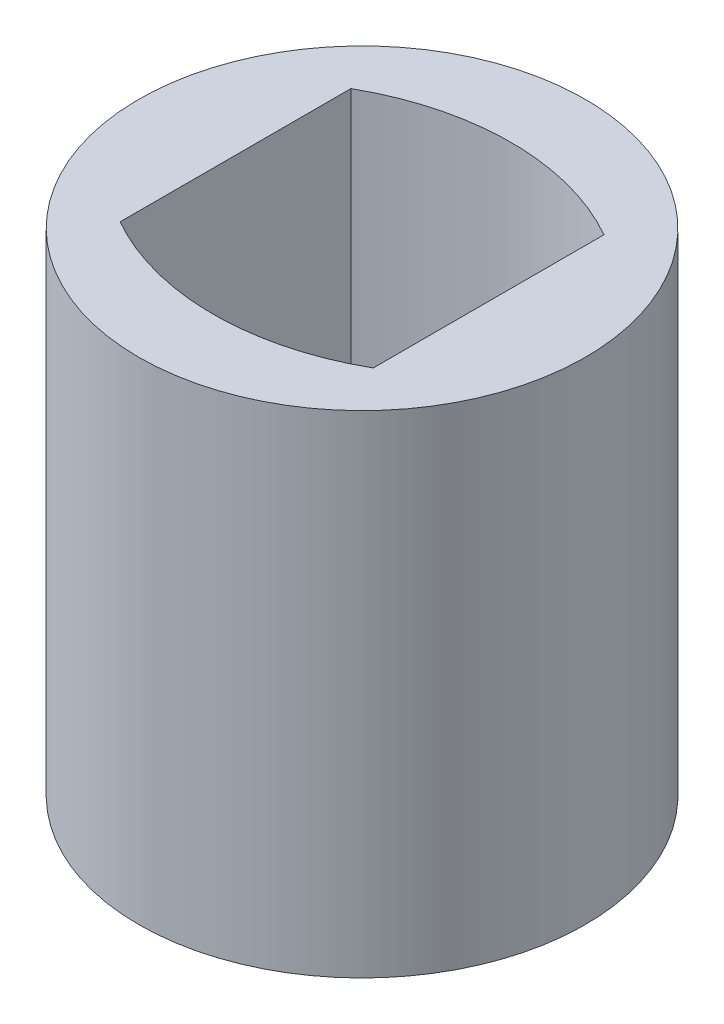
ISO-10303-21;
HEADER;
FILE_DESCRIPTION(('STEP AP214'),'2;1');
FILE_NAME('part.step','',(''),(''),'','','');
FILE_SCHEMA(('AUTOMOTIVE_DESIGN { 1 0 10303 214 1 1 1 1 }'));
ENDSEC;
DATA;
#1=APPLICATION_CONTEXT('core data for automotive mechanical design processes');
#2=APPLICATION_PROTOCOL_DEFINITION('international standard','automotive_design',2000,#1);
#3=PRODUCT_CONTEXT('',#1,'mechanical');
#4=PRODUCT('Part','Part','',(#3));
#5=PRODUCT_RELATED_PRODUCT_CATEGORY('part','',(#4));
#6=PRODUCT_DEFINITION_FORMATION('','',#4);
#7=PRODUCT_DEFINITION_CONTEXT('part definition',#1,'design');
#8=PRODUCT_DEFINITION('design','',#6,#7);
#9=PRODUCT_DEFINITION_SHAPE('','',#8);
#10=(LENGTH_UNIT() NAMED_UNIT(*) SI_UNIT(.MILLI.,.METRE.));
#11=(NAMED_UNIT(*) PLANE_ANGLE_UNIT() SI_UNIT($,.RADIAN.));
#12=(NAMED_UNIT(*) SI_UNIT($,.STERADIAN.) SOLID_ANGLE_UNIT());
#13=UNCERTAINTY_MEASURE_WITH_UNIT(LENGTH_MEASURE(1.E-05),#10,'distance_accuracy_value','');
#14=(GEOMETRIC_REPRESENTATION_CONTEXT(3) GLOBAL_UNCERTAINTY_ASSIGNED_CONTEXT((#13)) GLOBAL_UNIT_ASSIGNED_CONTEXT((#10,
#11,#12)) REPRESENTATION_CONTEXT('',''));
#15=CARTESIAN_POINT('',(0.,0.,0.));
#16=DIRECTION('',(0.,0.,1.));
#17=DIRECTION('',(1.,0.,0.));
#18=AXIS2_PLACEMENT_3D('',#15,#16,#17);
#19=CARTESIAN_POINT('',(0.,-1.27,0.));
#20=DIRECTION('',(0.,1.,0.));
#21=DIRECTION('',(0.,0.,1.));
#22=AXIS2_PLACEMENT_3D('',#19,#20,#21);
#23=PLANE('',#22);
#24=CARTESIAN_POINT('',(0.,-1.27,0.));
#25=DIRECTION('',(0.,1.,0.));
#26=DIRECTION('',(0.,0.,1.));
#27=AXIS2_PLACEMENT_3D('',#24,#25,#26);
#28=CIRCLE('',#27,3.81);
#29=CARTESIAN_POINT('',(0.,-1.27,3.81));
#30=VERTEX_POINT('',#29);
#31=EDGE_CURVE('E11',#30,#30,#28,.T.);
#32=ORIENTED_EDGE('',*,*,#31,.F.);
#33=EDGE_LOOP('',(#32));
#34=FACE_BOUND('',#33,.T.);
#35=CARTESIAN_POINT('',(0.,-1.27,-0.0518583333333272));
#36=DIRECTION('',(0.,-1.,0.));
#37=DIRECTION('',(0.,0.,1.));
#38=AXIS2_PLACEMENT_3D('',#35,#36,#37);
#39=CIRCLE('',#38,1.44885833333333);
#40=CARTESIAN_POINT('',(0.889000000000001,-1.27,1.0922));
#41=VERTEX_POINT('',#40);
#42=CARTESIAN_POINT('',(-0.888999999999999,-1.27,1.0922));
#43=VERTEX_POINT('',#42);
#44=EDGE_CURVE('E108',#41,#43,#39,.T.);
#45=ORIENTED_EDGE('',*,*,#44,.F.);
#46=DIRECTION('',(0.,0.,1.));
#47=VECTOR('',#46,1.);
#48=CARTESIAN_POINT('',(0.889000000000001,-1.27,1.0922));
#49=LINE('',#48,#47);
#50=CARTESIAN_POINT('',(0.889000000000001,-1.27,-1.0922));
#51=VERTEX_POINT('',#50);
#52=EDGE_CURVE('E143',#51,#41,#49,.T.);
#53=ORIENTED_EDGE('',*,*,#52,.F.);
#54=CARTESIAN_POINT('',(0.,-1.27,0.0518583333333265));
#55=DIRECTION('',(0.,-1.,0.));
#56=DIRECTION('',(0.,0.,-1.));
#57=AXIS2_PLACEMENT_3D('',#54,#55,#56);
#58=CIRCLE('',#57,1.44885833333333);
#59=CARTESIAN_POINT('',(-0.888999999999999,-1.27,-1.0922));
#60=VERTEX_POINT('',#59);
#61=EDGE_CURVE('E155',#60,#51,#58,.T.);
#62=ORIENTED_EDGE('',*,*,#61,.F.);
#63=DIRECTION('',(0.,0.,-1.));
#64=VECTOR('',#63,1.);
#65=CARTESIAN_POINT('',(-0.888999999999999,-1.27,1.0922));
#66=LINE('',#65,#64);
#67=EDGE_CURVE('E152',#43,#60,#66,.T.);
#68=ORIENTED_EDGE('',*,*,#67,.F.);
#69=EDGE_LOOP('',(#45,#53,#62,#68));
#70=FACE_BOUND('',#69,.T.);
#71=ADVANCED_FACE('F35',(#34,#70),#23,.F.);
#72=CARTESIAN_POINT('',(0.,1.27,0.));
#73=DIRECTION('',(0.,-1.,0.));
#74=DIRECTION('',(0.,0.,-1.));
#75=AXIS2_PLACEMENT_3D('',#72,#73,#74);
#76=CYLINDRICAL_SURFACE('',#75,3.81);
#77=ORIENTED_EDGE('',*,*,#31,.T.);
#78=EDGE_LOOP('',(#77));
#79=FACE_BOUND('',#78,.T.);
#80=CARTESIAN_POINT('',(0.,7.112,0.));
#81=DIRECTION('',(0.,1.,0.));
#82=DIRECTION('',(0.,0.,1.));
#83=AXIS2_PLACEMENT_3D('',#80,#81,#82);
#84=CIRCLE('',#83,3.81);
#85=CARTESIAN_POINT('',(0.,7.112,3.81));
#86=VERTEX_POINT('',#85);
#87=EDGE_CURVE('E121',#86,#86,#84,.T.);
#88=ORIENTED_EDGE('',*,*,#87,.F.);
#89=EDGE_LOOP('',(#88));
#90=FACE_BOUND('',#89,.T.);
#91=ADVANCED_FACE('F37',(#79,#90),#76,.T.);
#92=CARTESIAN_POINT('',(0.,-2.54,-0.0518583333333272));
#93=DIRECTION('',(0.,1.,0.));
#94=DIRECTION('',(0.,0.,1.));
#95=AXIS2_PLACEMENT_3D('',#92,#93,#94);
#96=CYLINDRICAL_SURFACE('',#95,1.44885833333333);
#97=ORIENTED_EDGE('',*,*,#44,.T.);
#98=DIRECTION('',(0.,1.,0.));
#99=VECTOR('',#98,1.);
#100=CARTESIAN_POINT('',(-0.888999999999999,-2.54,1.0922));
#101=LINE('',#100,#99);
#102=CARTESIAN_POINT('',(-0.888999999999999,-2.54,1.0922));
#103=VERTEX_POINT('',#102);
#104=EDGE_CURVE('E43',#103,#43,#101,.T.);
#105=ORIENTED_EDGE('',*,*,#104,.F.);
#106=CARTESIAN_POINT('',(0.,-2.54,-0.0518583333333272));
#107=DIRECTION('',(0.,-1.,0.));
#108=DIRECTION('',(0.,0.,1.));
#109=AXIS2_PLACEMENT_3D('',#106,#107,#108);
#110=CIRCLE('',#109,1.44885833333333);
#111=CARTESIAN_POINT('',(0.889000000000001,-2.54,1.0922));
#112=VERTEX_POINT('',#111);
#113=EDGE_CURVE('E139',#112,#103,#110,.T.);
#114=ORIENTED_EDGE('',*,*,#113,.F.);
#115=DIRECTION('',(0.,1.,0.));
#116=VECTOR('',#115,1.);
#117=CARTESIAN_POINT('',(0.889000000000001,-2.54,1.0922));
#118=LINE('',#117,#116);
#119=EDGE_CURVE('E149',#112,#41,#118,.T.);
#120=ORIENTED_EDGE('',*,*,#119,.T.);
#121=EDGE_LOOP('',(#97,#105,#114,#120));
#122=FACE_BOUND('',#121,.T.);
#123=ADVANCED_FACE('F174',(#122),#96,.T.);
#124=CARTESIAN_POINT('',(-0.888999999999999,-2.54,1.0922));
#125=DIRECTION('',(1.,0.,0.));
#126=DIRECTION('',(0.,0.,-1.));
#127=AXIS2_PLACEMENT_3D('',#124,#125,#126);
#128=PLANE('',#127);
#129=ORIENTED_EDGE('',*,*,#67,.T.);
#130=DIRECTION('',(0.,1.,0.));
#131=VECTOR('',#130,1.);
#132=CARTESIAN_POINT('',(-0.888999999999999,-2.54,-1.0922));
#133=LINE('',#132,#131);
#134=CARTESIAN_POINT('',(-0.888999999999999,-2.54,-1.0922));
#135=VERTEX_POINT('',#134);
#136=EDGE_CURVE('E165',#135,#60,#133,.T.);
#137=ORIENTED_EDGE('',*,*,#136,.F.);
#138=DIRECTION('',(0.,0.,-1.));
#139=VECTOR('',#138,1.);
#140=CARTESIAN_POINT('',(-0.888999999999999,-2.54,1.0922));
#141=LINE('',#140,#139);
#142=EDGE_CURVE('E142',#103,#135,#141,.T.);
#143=ORIENTED_EDGE('',*,*,#142,.F.);
#144=ORIENTED_EDGE('',*,*,#104,.T.);
#145=EDGE_LOOP('',(#129,#137,#143,#144));
#146=FACE_BOUND('',#145,.T.);
#147=ADVANCED_FACE('F170',(#146),#128,.F.);
#148=CARTESIAN_POINT('',(0.,-2.54,0.0518583333333265));
#149=DIRECTION('',(0.,1.,0.));
#150=DIRECTION('',(0.,0.,1.));
#151=AXIS2_PLACEMENT_3D('',#148,#149,#150);
#152=CYLINDRICAL_SURFACE('',#151,1.44885833333333);
#153=ORIENTED_EDGE('',*,*,#61,.T.);
#154=DIRECTION('',(0.,1.,0.));
#155=VECTOR('',#154,1.);
#156=CARTESIAN_POINT('',(0.889,-2.54,-1.0922));
#157=LINE('',#156,#155);
#158=CARTESIAN_POINT('',(0.889,-2.54,-1.0922));
#159=VERTEX_POINT('',#158);
#160=EDGE_CURVE('E162',#159,#51,#157,.T.);
#161=ORIENTED_EDGE('',*,*,#160,.F.);
#162=CARTESIAN_POINT('',(0.,-2.54,0.0518583333333265));
#163=DIRECTION('',(0.,-1.,0.));
#164=DIRECTION('',(0.,0.,-1.));
#165=AXIS2_PLACEMENT_3D('',#162,#163,#164);
#166=CIRCLE('',#165,1.44885833333333);
#167=EDGE_CURVE('E145',#135,#159,#166,.T.);
#168=ORIENTED_EDGE('',*,*,#167,.F.);
#169=ORIENTED_EDGE('',*,*,#136,.T.);
#170=EDGE_LOOP('',(#153,#161,#168,#169));
#171=FACE_BOUND('',#170,.T.);
#172=ADVANCED_FACE('F183',(#171),#152,.T.);
#173=CARTESIAN_POINT('',(0.889000000000001,-2.54,1.0922));
#174=DIRECTION('',(-1.,0.,0.));
#175=DIRECTION('',(0.,0.,1.));
#176=AXIS2_PLACEMENT_3D('',#173,#174,#175);
#177=PLANE('',#176);
#178=ORIENTED_EDGE('',*,*,#52,.T.);
#179=ORIENTED_EDGE('',*,*,#119,.F.);
#180=DIRECTION('',(0.,0.,1.));
#181=VECTOR('',#180,1.);
#182=CARTESIAN_POINT('',(0.889000000000001,-2.54,1.0922));
#183=LINE('',#182,#181);
#184=EDGE_CURVE('E147',#159,#112,#183,.T.);
#185=ORIENTED_EDGE('',*,*,#184,.F.);
#186=ORIENTED_EDGE('',*,*,#160,.T.);
#187=EDGE_LOOP('',(#178,#179,#185,#186));
#188=FACE_BOUND('',#187,.T.);
#189=ADVANCED_FACE('F178',(#188),#177,.F.);
#190=CARTESIAN_POINT('',(0.,-2.54,-0.0518583333333272));
#191=DIRECTION('',(0.,1.,0.));
#192=DIRECTION('',(0.,0.,1.));
#193=AXIS2_PLACEMENT_3D('',#190,#191,#192);
#194=PLANE('',#193);
#195=ORIENTED_EDGE('',*,*,#113,.T.);
#196=ORIENTED_EDGE('',*,*,#142,.T.);
#197=ORIENTED_EDGE('',*,*,#167,.T.);
#198=ORIENTED_EDGE('',*,*,#184,.T.);
#199=EDGE_LOOP('',(#195,#196,#197,#198));
#200=FACE_BOUND('',#199,.T.);
#201=ADVANCED_FACE('F185',(#200),#194,.F.);
#202=CARTESIAN_POINT('',(-2.159,7.112,0.));
#203=DIRECTION('',(1.,0.,0.));
#204=DIRECTION('',(0.,0.,-1.));
#205=AXIS2_PLACEMENT_3D('',#202,#203,#204);
#206=PLANE('',#205);
#207=DIRECTION('',(0.,0.,1.));
#208=VECTOR('',#207,1.);
#209=CARTESIAN_POINT('',(-2.159,1.27,0.));
#210=LINE('',#209,#208);
#211=CARTESIAN_POINT('',(-2.159,1.27,-1.9685));
#212=VERTEX_POINT('',#211);
#213=CARTESIAN_POINT('',(-2.159,1.27,1.9685));
#214=VERTEX_POINT('',#213);
#215=EDGE_CURVE('E106',#212,#214,#210,.T.);
#216=ORIENTED_EDGE('',*,*,#215,.F.);
#217=DIRECTION('',(0.,-1.,0.));
#218=VECTOR('',#217,1.);
#219=CARTESIAN_POINT('',(-2.159,7.112,-1.9685));
#220=LINE('',#219,#218);
#221=CARTESIAN_POINT('',(-2.159,7.112,-1.9685));
#222=VERTEX_POINT('',#221);
#223=EDGE_CURVE('E99',#222,#212,#220,.T.);
#224=ORIENTED_EDGE('',*,*,#223,.F.);
#225=DIRECTION('',(0.,0.,1.));
#226=VECTOR('',#225,1.);
#227=CARTESIAN_POINT('',(-2.159,7.112,0.));
#228=LINE('',#227,#226);
#229=CARTESIAN_POINT('',(-2.159,7.112,1.9685));
#230=VERTEX_POINT('',#229);
#231=EDGE_CURVE('E104',#222,#230,#228,.T.);
#232=ORIENTED_EDGE('',*,*,#231,.T.);
#233=DIRECTION('',(0.,-1.,0.));
#234=VECTOR('',#233,1.);
#235=CARTESIAN_POINT('',(-2.159,7.112,1.9685));
#236=LINE('',#235,#234);
#237=EDGE_CURVE('E129',#230,#214,#236,.T.);
#238=ORIENTED_EDGE('',*,*,#237,.T.);
#239=EDGE_LOOP('',(#216,#224,#232,#238));
#240=FACE_BOUND('',#239,.T.);
#241=ADVANCED_FACE('F101',(#240),#206,.T.);
#242=CARTESIAN_POINT('',(0.,7.112,1.8238611111111));
#243=DIRECTION('',(0.,-1.,0.));
#244=DIRECTION('',(0.,0.,-1.));
#245=AXIS2_PLACEMENT_3D('',#242,#243,#244);
#246=CYLINDRICAL_SURFACE('',#245,4.3638611111111);
#247=CARTESIAN_POINT('',(0.,1.27,1.8238611111111));
#248=DIRECTION('',(0.,1.,0.));
#249=DIRECTION('',(0.,0.,1.));
#250=AXIS2_PLACEMENT_3D('',#247,#248,#249);
#251=CIRCLE('',#250,4.3638611111111);
#252=CARTESIAN_POINT('',(2.159,1.27,-1.9685));
#253=VERTEX_POINT('',#252);
#254=EDGE_CURVE('E50',#212,#253,#251,.F.);
#255=ORIENTED_EDGE('',*,*,#254,.T.);
#256=DIRECTION('',(0.,-1.,0.));
#257=VECTOR('',#256,1.);
#258=CARTESIAN_POINT('',(2.159,7.112,-1.9685));
#259=LINE('',#258,#257);
#260=CARTESIAN_POINT('',(2.159,7.112,-1.9685));
#261=VERTEX_POINT('',#260);
#262=EDGE_CURVE('E109',#261,#253,#259,.T.);
#263=ORIENTED_EDGE('',*,*,#262,.F.);
#264=CARTESIAN_POINT('',(0.,7.112,1.8238611111111));
#265=DIRECTION('',(0.,1.,0.));
#266=DIRECTION('',(0.,0.,1.));
#267=AXIS2_PLACEMENT_3D('',#264,#265,#266);
#268=CIRCLE('',#267,4.3638611111111);
#269=EDGE_CURVE('E113',#222,#261,#268,.F.);
#270=ORIENTED_EDGE('',*,*,#269,.F.);
#271=ORIENTED_EDGE('',*,*,#223,.T.);
#272=EDGE_LOOP('',(#255,#263,#270,#271));
#273=FACE_BOUND('',#272,.T.);
#274=ADVANCED_FACE('F114',(#273),#246,.F.);
#275=CARTESIAN_POINT('',(2.159,7.112,0.));
#276=DIRECTION('',(1.,0.,0.));
#277=DIRECTION('',(0.,0.,-1.));
#278=AXIS2_PLACEMENT_3D('',#275,#276,#277);
#279=PLANE('',#278);
#280=DIRECTION('',(0.,0.,1.));
#281=VECTOR('',#280,1.);
#282=CARTESIAN_POINT('',(2.159,1.27,0.));
#283=LINE('',#282,#281);
#284=CARTESIAN_POINT('',(2.159,1.27,1.9685));
#285=VERTEX_POINT('',#284);
#286=EDGE_CURVE('E55',#253,#285,#283,.T.);
#287=ORIENTED_EDGE('',*,*,#286,.T.);
#288=DIRECTION('',(0.,-1.,0.));
#289=VECTOR('',#288,1.);
#290=CARTESIAN_POINT('',(2.159,7.112,1.9685));
#291=LINE('',#290,#289);
#292=CARTESIAN_POINT('',(2.159,7.112,1.9685));
#293=VERTEX_POINT('',#292);
#294=EDGE_CURVE('E135',#293,#285,#291,.T.);
#295=ORIENTED_EDGE('',*,*,#294,.F.);
#296=DIRECTION('',(0.,0.,1.));
#297=VECTOR('',#296,1.);
#298=CARTESIAN_POINT('',(2.159,7.112,0.));
#299=LINE('',#298,#297);
#300=EDGE_CURVE('E116',#261,#293,#299,.T.);
#301=ORIENTED_EDGE('',*,*,#300,.F.);
#302=ORIENTED_EDGE('',*,*,#262,.T.);
#303=EDGE_LOOP('',(#287,#295,#301,#302));
#304=FACE_BOUND('',#303,.T.);
#305=ADVANCED_FACE('F245',(#304),#279,.F.);
#306=CARTESIAN_POINT('',(0.,7.112,-1.82386111111112));
#307=DIRECTION('',(0.,-1.,0.));
#308=DIRECTION('',(0.,0.,-1.));
#309=AXIS2_PLACEMENT_3D('',#306,#307,#308);
#310=CYLINDRICAL_SURFACE('',#309,4.36386111111112);
#311=CARTESIAN_POINT('',(0.,1.27,-1.82386111111112));
#312=DIRECTION('',(0.,1.,0.));
#313=DIRECTION('',(0.,0.,1.));
#314=AXIS2_PLACEMENT_3D('',#311,#312,#313);
#315=CIRCLE('',#314,4.36386111111112);
#316=EDGE_CURVE('E124',#214,#285,#315,.T.);
#317=ORIENTED_EDGE('',*,*,#316,.F.);
#318=ORIENTED_EDGE('',*,*,#237,.F.);
#319=CARTESIAN_POINT('',(0.,7.112,-1.82386111111112));
#320=DIRECTION('',(0.,1.,0.));
#321=DIRECTION('',(0.,0.,1.));
#322=AXIS2_PLACEMENT_3D('',#319,#320,#321);
#323=CIRCLE('',#322,4.36386111111112);
#324=EDGE_CURVE('E120',#230,#293,#323,.T.);
#325=ORIENTED_EDGE('',*,*,#324,.T.);
#326=ORIENTED_EDGE('',*,*,#294,.T.);
#327=EDGE_LOOP('',(#317,#318,#325,#326));
#328=FACE_BOUND('',#327,.T.);
#329=ADVANCED_FACE('F254',(#328),#310,.F.);
#330=CARTESIAN_POINT('',(0.,7.112,0.));
#331=DIRECTION('',(0.,1.,0.));
#332=DIRECTION('',(0.,0.,1.));
#333=AXIS2_PLACEMENT_3D('',#330,#331,#332);
#334=PLANE('',#333);
#335=ORIENTED_EDGE('',*,*,#87,.T.);
#336=EDGE_LOOP('',(#335));
#337=FACE_BOUND('',#336,.T.);
#338=ORIENTED_EDGE('',*,*,#231,.F.);
#339=ORIENTED_EDGE('',*,*,#269,.T.);
#340=ORIENTED_EDGE('',*,*,#300,.T.);
#341=ORIENTED_EDGE('',*,*,#324,.F.);
#342=EDGE_LOOP('',(#338,#339,#340,#341));
#343=FACE_BOUND('',#342,.T.);
#344=ADVANCED_FACE('F118',(#337,#343),#334,.T.);
#345=CARTESIAN_POINT('',(0.,1.27,0.));
#346=DIRECTION('',(0.,1.,0.));
#347=DIRECTION('',(0.,0.,1.));
#348=AXIS2_PLACEMENT_3D('',#345,#346,#347);
#349=PLANE('',#348);
#350=ORIENTED_EDGE('',*,*,#215,.T.);
#351=ORIENTED_EDGE('',*,*,#316,.T.);
#352=ORIENTED_EDGE('',*,*,#286,.F.);
#353=ORIENTED_EDGE('',*,*,#254,.F.);
#354=EDGE_LOOP('',(#350,#351,#352,#353));
#355=FACE_BOUND('',#354,.T.);
#356=ADVANCED_FACE('F202',(#355),#349,.T.);
#357=CLOSED_SHELL('',(#71,#91,#123,#147,#172,#189,#201,#241,#274,#305,#329,#344,#356));
#358=MANIFOLD_SOLID_BREP('B2',#357);
#359=ADVANCED_BREP_SHAPE_REPRESENTATION('',(#18,#358),#14);
#360=SHAPE_DEFINITION_REPRESENTATION(#9,#359);
ENDSEC;
END-ISO-10303-21;
